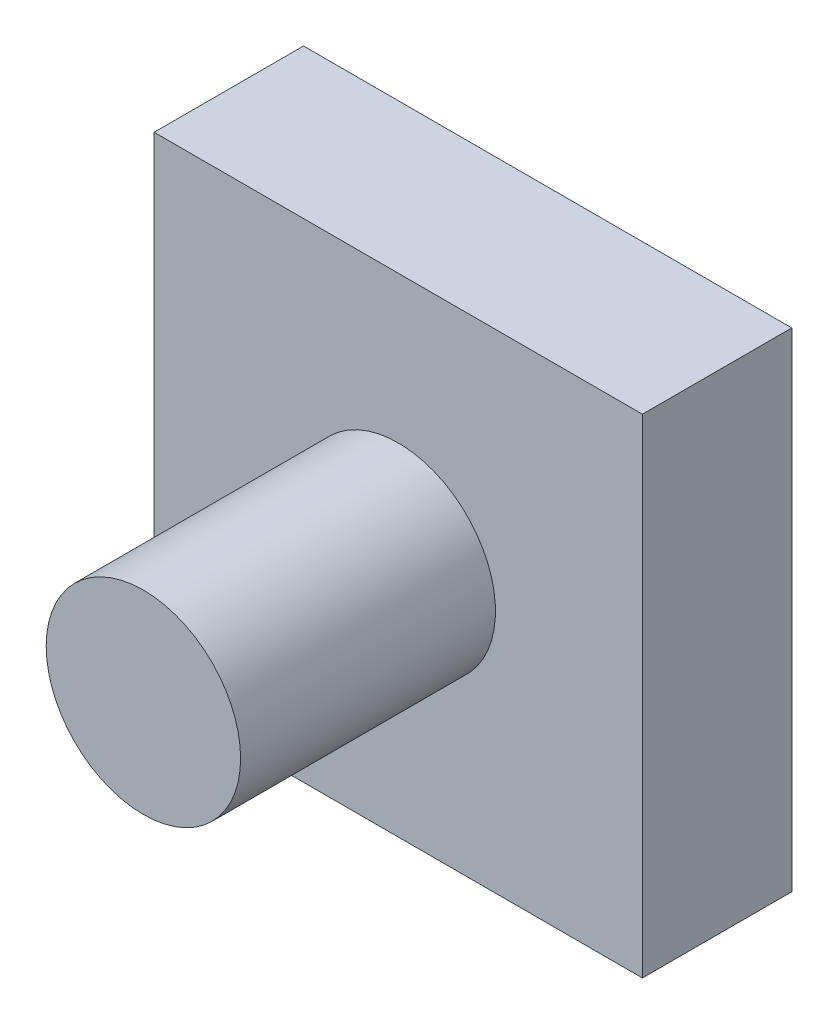
ISO-10303-21;
HEADER;
FILE_DESCRIPTION(('STEP AP214'),'2;1');
FILE_NAME('part.step','',(''),(''),'','','');
FILE_SCHEMA(('AUTOMOTIVE_DESIGN { 1 0 10303 214 1 1 1 1 }'));
ENDSEC;
DATA;
#1=APPLICATION_CONTEXT('core data for automotive mechanical design processes');
#2=APPLICATION_PROTOCOL_DEFINITION('international standard','automotive_design',2000,#1);
#3=PRODUCT_CONTEXT('',#1,'mechanical');
#4=PRODUCT('Part','Part','',(#3));
#5=PRODUCT_RELATED_PRODUCT_CATEGORY('part','',(#4));
#6=PRODUCT_DEFINITION_FORMATION('','',#4);
#7=PRODUCT_DEFINITION_CONTEXT('part definition',#1,'design');
#8=PRODUCT_DEFINITION('design','',#6,#7);
#9=PRODUCT_DEFINITION_SHAPE('','',#8);
#10=(LENGTH_UNIT() NAMED_UNIT(*) SI_UNIT(.MILLI.,.METRE.));
#11=(NAMED_UNIT(*) PLANE_ANGLE_UNIT() SI_UNIT($,.RADIAN.));
#12=(NAMED_UNIT(*) SI_UNIT($,.STERADIAN.) SOLID_ANGLE_UNIT());
#13=UNCERTAINTY_MEASURE_WITH_UNIT(LENGTH_MEASURE(1.E-05),#10,'distance_accuracy_value','');
#14=(GEOMETRIC_REPRESENTATION_CONTEXT(3) GLOBAL_UNCERTAINTY_ASSIGNED_CONTEXT((#13)) GLOBAL_UNIT_ASSIGNED_CONTEXT((#10,
#11,#12)) REPRESENTATION_CONTEXT('',''));
#15=CARTESIAN_POINT('',(0.,0.,0.));
#16=DIRECTION('',(0.,0.,1.));
#17=DIRECTION('',(1.,0.,0.));
#18=AXIS2_PLACEMENT_3D('',#15,#16,#17);
#19=CARTESIAN_POINT('',(17.6403,17.6403,10.795));
#20=DIRECTION('',(0.,0.,-1.));
#21=DIRECTION('',(-1.,0.,0.));
#22=AXIS2_PLACEMENT_3D('',#19,#20,#21);
#23=PLANE('',#22);
#24=DIRECTION('',(0.,1.,0.));
#25=VECTOR('',#24,1.);
#26=CARTESIAN_POINT('',(17.6403,-17.6403,10.795));
#27=LINE('',#26,#25);
#28=CARTESIAN_POINT('',(17.6403,-17.6403,10.795));
#29=VERTEX_POINT('',#28);
#30=CARTESIAN_POINT('',(17.6403,17.6403,10.795));
#31=VERTEX_POINT('',#30);
#32=EDGE_CURVE('E101',#29,#31,#27,.T.);
#33=ORIENTED_EDGE('',*,*,#32,.T.);
#34=DIRECTION('',(-1.,0.,0.));
#35=VECTOR('',#34,1.);
#36=CARTESIAN_POINT('',(-17.6403,17.6403,10.795));
#37=LINE('',#36,#35);
#38=CARTESIAN_POINT('',(-17.6403,17.6403,10.795));
#39=VERTEX_POINT('',#38);
#40=EDGE_CURVE('E95',#31,#39,#37,.T.);
#41=ORIENTED_EDGE('',*,*,#40,.T.);
#42=DIRECTION('',(0.,-1.,0.));
#43=VECTOR('',#42,1.);
#44=CARTESIAN_POINT('',(-17.6403,-17.6403,10.795));
#45=LINE('',#44,#43);
#46=CARTESIAN_POINT('',(-17.6403,-17.6403,10.795));
#47=VERTEX_POINT('',#46);
#48=EDGE_CURVE('E99',#39,#47,#45,.T.);
#49=ORIENTED_EDGE('',*,*,#48,.T.);
#50=DIRECTION('',(1.,0.,0.));
#51=VECTOR('',#50,1.);
#52=CARTESIAN_POINT('',(-17.6403,-17.6403,10.795));
#53=LINE('',#52,#51);
#54=EDGE_CURVE('E63',#47,#29,#53,.T.);
#55=ORIENTED_EDGE('',*,*,#54,.T.);
#56=EDGE_LOOP('',(#33,#41,#49,#55));
#57=FACE_BOUND('',#56,.T.);
#58=CARTESIAN_POINT('',(0.,0.,10.795));
#59=DIRECTION('',(0.,0.,-1.));
#60=DIRECTION('',(-1.,0.,0.));
#61=AXIS2_PLACEMENT_3D('',#58,#59,#60);
#62=CIRCLE('',#61,7.0231);
#63=CARTESIAN_POINT('',(-7.0231,0.,10.795));
#64=VERTEX_POINT('',#63);
#65=EDGE_CURVE('E11',#64,#64,#62,.F.);
#66=ORIENTED_EDGE('',*,*,#65,.F.);
#67=EDGE_LOOP('',(#66));
#68=FACE_BOUND('',#67,.T.);
#69=ADVANCED_FACE('F43',(#57,#68),#23,.F.);
#70=CARTESIAN_POINT('',(17.6403,-17.6403,10.795));
#71=DIRECTION('',(-1.,0.,0.));
#72=DIRECTION('',(0.,0.,1.));
#73=AXIS2_PLACEMENT_3D('',#70,#71,#72);
#74=PLANE('',#73);
#75=DIRECTION('',(0.,1.,0.));
#76=VECTOR('',#75,1.);
#77=CARTESIAN_POINT('',(17.6403,-17.6403,0.));
#78=LINE('',#77,#76);
#79=CARTESIAN_POINT('',(17.6403,-17.6403,0.));
#80=VERTEX_POINT('',#79);
#81=CARTESIAN_POINT('',(17.6403,17.6403,0.));
#82=VERTEX_POINT('',#81);
#83=EDGE_CURVE('E119',#80,#82,#78,.T.);
#84=ORIENTED_EDGE('',*,*,#83,.T.);
#85=DIRECTION('',(0.,0.,-1.));
#86=VECTOR('',#85,1.);
#87=CARTESIAN_POINT('',(17.6403,17.6403,10.795));
#88=LINE('',#87,#86);
#89=EDGE_CURVE('E53',#31,#82,#88,.T.);
#90=ORIENTED_EDGE('',*,*,#89,.F.);
#91=ORIENTED_EDGE('',*,*,#32,.F.);
#92=DIRECTION('',(0.,0.,-1.));
#93=VECTOR('',#92,1.);
#94=CARTESIAN_POINT('',(17.6403,-17.6403,10.795));
#95=LINE('',#94,#93);
#96=EDGE_CURVE('E115',#29,#80,#95,.T.);
#97=ORIENTED_EDGE('',*,*,#96,.T.);
#98=EDGE_LOOP('',(#84,#90,#91,#97));
#99=FACE_BOUND('',#98,.T.);
#100=ADVANCED_FACE('F45',(#99),#74,.F.);
#101=CARTESIAN_POINT('',(-17.6403,17.6403,10.795));
#102=DIRECTION('',(0.,-1.,0.));
#103=DIRECTION('',(0.,0.,-1.));
#104=AXIS2_PLACEMENT_3D('',#101,#102,#103);
#105=PLANE('',#104);
#106=DIRECTION('',(-1.,0.,0.));
#107=VECTOR('',#106,1.);
#108=CARTESIAN_POINT('',(-17.6403,17.6403,0.));
#109=LINE('',#108,#107);
#110=CARTESIAN_POINT('',(-17.6403,17.6403,0.));
#111=VERTEX_POINT('',#110);
#112=EDGE_CURVE('E107',#82,#111,#109,.T.);
#113=ORIENTED_EDGE('',*,*,#112,.T.);
#114=DIRECTION('',(0.,0.,-1.));
#115=VECTOR('',#114,1.);
#116=CARTESIAN_POINT('',(-17.6403,17.6403,10.795));
#117=LINE('',#116,#115);
#118=EDGE_CURVE('E105',#39,#111,#117,.T.);
#119=ORIENTED_EDGE('',*,*,#118,.F.);
#120=ORIENTED_EDGE('',*,*,#40,.F.);
#121=ORIENTED_EDGE('',*,*,#89,.T.);
#122=EDGE_LOOP('',(#113,#119,#120,#121));
#123=FACE_BOUND('',#122,.T.);
#124=ADVANCED_FACE('F106',(#123),#105,.F.);
#125=CARTESIAN_POINT('',(-17.6403,-17.6403,10.795));
#126=DIRECTION('',(1.,0.,0.));
#127=DIRECTION('',(0.,0.,-1.));
#128=AXIS2_PLACEMENT_3D('',#125,#126,#127);
#129=PLANE('',#128);
#130=DIRECTION('',(0.,-1.,0.));
#131=VECTOR('',#130,1.);
#132=CARTESIAN_POINT('',(-17.6403,-17.6403,0.));
#133=LINE('',#132,#131);
#134=CARTESIAN_POINT('',(-17.6403,-17.6403,0.));
#135=VERTEX_POINT('',#134);
#136=EDGE_CURVE('E81',#111,#135,#133,.T.);
#137=ORIENTED_EDGE('',*,*,#136,.T.);
#138=DIRECTION('',(0.,0.,-1.));
#139=VECTOR('',#138,1.);
#140=CARTESIAN_POINT('',(-17.6403,-17.6403,10.795));
#141=LINE('',#140,#139);
#142=EDGE_CURVE('E109',#47,#135,#141,.T.);
#143=ORIENTED_EDGE('',*,*,#142,.F.);
#144=ORIENTED_EDGE('',*,*,#48,.F.);
#145=ORIENTED_EDGE('',*,*,#118,.T.);
#146=EDGE_LOOP('',(#137,#143,#144,#145));
#147=FACE_BOUND('',#146,.T.);
#148=ADVANCED_FACE('F111',(#147),#129,.F.);
#149=CARTESIAN_POINT('',(-17.6403,-17.6403,10.795));
#150=DIRECTION('',(0.,1.,0.));
#151=DIRECTION('',(0.,0.,1.));
#152=AXIS2_PLACEMENT_3D('',#149,#150,#151);
#153=PLANE('',#152);
#154=DIRECTION('',(1.,0.,0.));
#155=VECTOR('',#154,1.);
#156=CARTESIAN_POINT('',(-17.6403,-17.6403,0.));
#157=LINE('',#156,#155);
#158=EDGE_CURVE('E87',#135,#80,#157,.T.);
#159=ORIENTED_EDGE('',*,*,#158,.T.);
#160=ORIENTED_EDGE('',*,*,#96,.F.);
#161=ORIENTED_EDGE('',*,*,#54,.F.);
#162=ORIENTED_EDGE('',*,*,#142,.T.);
#163=EDGE_LOOP('',(#159,#160,#161,#162));
#164=FACE_BOUND('',#163,.T.);
#165=ADVANCED_FACE('F139',(#164),#153,.F.);
#166=CARTESIAN_POINT('',(17.6403,17.6403,0.));
#167=DIRECTION('',(0.,0.,-1.));
#168=DIRECTION('',(-1.,0.,0.));
#169=AXIS2_PLACEMENT_3D('',#166,#167,#168);
#170=PLANE('',#169);
#171=ORIENTED_EDGE('',*,*,#83,.F.);
#172=ORIENTED_EDGE('',*,*,#158,.F.);
#173=ORIENTED_EDGE('',*,*,#136,.F.);
#174=ORIENTED_EDGE('',*,*,#112,.F.);
#175=EDGE_LOOP('',(#171,#172,#173,#174));
#176=FACE_BOUND('',#175,.T.);
#177=ADVANCED_FACE('F136',(#176),#170,.T.);
#178=CARTESIAN_POINT('',(0.,0.,29.21));
#179=DIRECTION('',(0.,0.,-1.));
#180=DIRECTION('',(-1.,0.,0.));
#181=AXIS2_PLACEMENT_3D('',#178,#179,#180);
#182=CYLINDRICAL_SURFACE('',#181,7.0231);
#183=CARTESIAN_POINT('',(0.,0.,29.21));
#184=DIRECTION('',(0.,0.,1.));
#185=DIRECTION('',(1.,0.,0.));
#186=AXIS2_PLACEMENT_3D('',#183,#184,#185);
#187=CIRCLE('',#186,7.0231);
#188=CARTESIAN_POINT('',(7.0231,0.,29.21));
#189=VERTEX_POINT('',#188);
#190=EDGE_CURVE('E123',#189,#189,#187,.T.);
#191=ORIENTED_EDGE('',*,*,#190,.F.);
#192=EDGE_LOOP('',(#191));
#193=FACE_BOUND('',#192,.T.);
#194=ORIENTED_EDGE('',*,*,#65,.T.);
#195=EDGE_LOOP('',(#194));
#196=FACE_BOUND('',#195,.T.);
#197=ADVANCED_FACE('F138',(#193,#196),#182,.T.);
#198=CARTESIAN_POINT('',(0.,0.,29.21));
#199=DIRECTION('',(0.,0.,1.));
#200=DIRECTION('',(1.,0.,0.));
#201=AXIS2_PLACEMENT_3D('',#198,#199,#200);
#202=PLANE('',#201);
#203=ORIENTED_EDGE('',*,*,#190,.T.);
#204=EDGE_LOOP('',(#203));
#205=FACE_BOUND('',#204,.T.);
#206=ADVANCED_FACE('F144',(#205),#202,.T.);
#207=CLOSED_SHELL('',(#69,#100,#124,#148,#165,#177,#197,#206));
#208=MANIFOLD_SOLID_BREP('B2',#207);
#209=ADVANCED_BREP_SHAPE_REPRESENTATION('',(#18,#208),#14);
#210=SHAPE_DEFINITION_REPRESENTATION(#9,#209);
ENDSEC;
END-ISO-10303-21;
